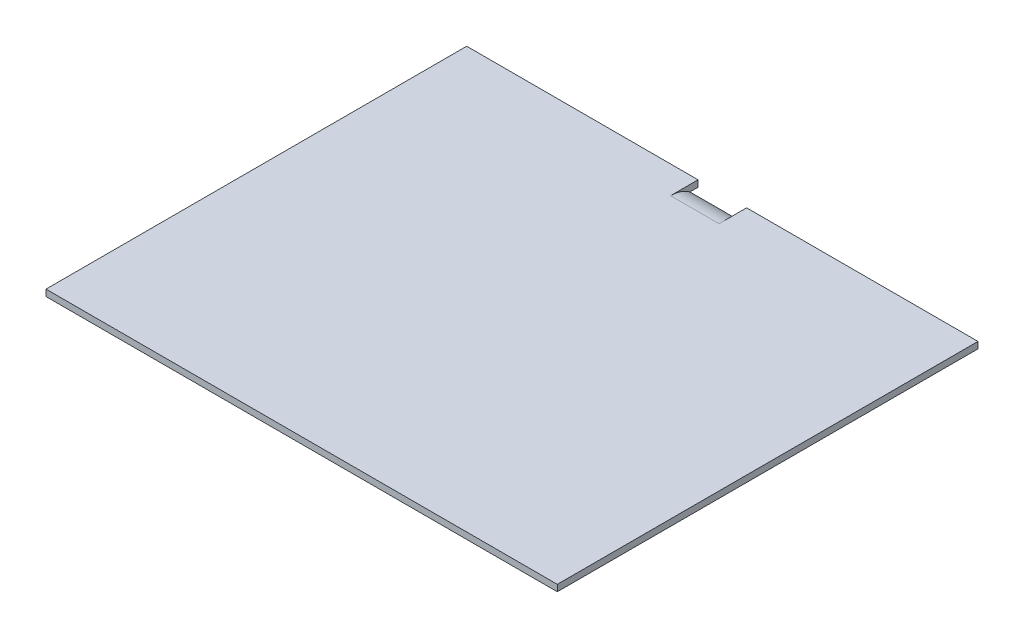
ISO-10303-21;
HEADER;
FILE_DESCRIPTION(('STEP AP214'),'2;1');
FILE_NAME('part.step','',(''),(''),'','','');
FILE_SCHEMA(('AUTOMOTIVE_DESIGN { 1 0 10303 214 1 1 1 1 }'));
ENDSEC;
DATA;
#1=APPLICATION_CONTEXT('core data for automotive mechanical design processes');
#2=APPLICATION_PROTOCOL_DEFINITION('international standard','automotive_design',2000,#1);
#3=PRODUCT_CONTEXT('',#1,'mechanical');
#4=PRODUCT('Part','Part','',(#3));
#5=PRODUCT_RELATED_PRODUCT_CATEGORY('part','',(#4));
#6=PRODUCT_DEFINITION_FORMATION('','',#4);
#7=PRODUCT_DEFINITION_CONTEXT('part definition',#1,'design');
#8=PRODUCT_DEFINITION('design','',#6,#7);
#9=PRODUCT_DEFINITION_SHAPE('','',#8);
#10=(LENGTH_UNIT() NAMED_UNIT(*) SI_UNIT(.MILLI.,.METRE.));
#11=(NAMED_UNIT(*) PLANE_ANGLE_UNIT() SI_UNIT($,.RADIAN.));
#12=(NAMED_UNIT(*) SI_UNIT($,.STERADIAN.) SOLID_ANGLE_UNIT());
#13=UNCERTAINTY_MEASURE_WITH_UNIT(LENGTH_MEASURE(1.E-05),#10,'distance_accuracy_value','');
#14=(GEOMETRIC_REPRESENTATION_CONTEXT(3) GLOBAL_UNCERTAINTY_ASSIGNED_CONTEXT((#13)) GLOBAL_UNIT_ASSIGNED_CONTEXT((#10,
#11,#12)) REPRESENTATION_CONTEXT('',''));
#15=CARTESIAN_POINT('',(0.,0.,0.));
#16=DIRECTION('',(0.,0.,1.));
#17=DIRECTION('',(1.,0.,0.));
#18=AXIS2_PLACEMENT_3D('',#15,#16,#17);
#19=CARTESIAN_POINT('',(-39.5,1.,-32.5));
#20=DIRECTION('',(0.,0.,1.));
#21=DIRECTION('',(1.,0.,0.));
#22=AXIS2_PLACEMENT_3D('',#19,#20,#21);
#23=PLANE('',#22);
#24=DIRECTION('',(-1.,0.,0.));
#25=VECTOR('',#24,1.);
#26=CARTESIAN_POINT('',(-39.5,1.,-32.5));
#27=LINE('',#26,#25);
#28=CARTESIAN_POINT('',(-3.74999999999999,1.,-32.5));
#29=VERTEX_POINT('',#28);
#30=CARTESIAN_POINT('',(-39.5,1.,-32.5));
#31=VERTEX_POINT('',#30);
#32=EDGE_CURVE('E118',#29,#31,#27,.T.);
#33=ORIENTED_EDGE('',*,*,#32,.F.);
#34=DIRECTION('',(0.,1.,0.));
#35=VECTOR('',#34,1.);
#36=CARTESIAN_POINT('',(-3.74999999999998,4.25,-32.5));
#37=LINE('',#36,#35);
#38=CARTESIAN_POINT('',(-3.74999999999999,0.,-32.5));
#39=VERTEX_POINT('',#38);
#40=EDGE_CURVE('E105',#39,#29,#37,.T.);
#41=ORIENTED_EDGE('',*,*,#40,.F.);
#42=DIRECTION('',(-1.,0.,0.));
#43=VECTOR('',#42,1.);
#44=CARTESIAN_POINT('',(-39.5,0.,-32.5));
#45=LINE('',#44,#43);
#46=CARTESIAN_POINT('',(-39.5,0.,-32.5));
#47=VERTEX_POINT('',#46);
#48=EDGE_CURVE('E116',#39,#47,#45,.T.);
#49=ORIENTED_EDGE('',*,*,#48,.T.);
#50=DIRECTION('',(0.,-1.,0.));
#51=VECTOR('',#50,1.);
#52=CARTESIAN_POINT('',(-39.5,1.,-32.5));
#53=LINE('',#52,#51);
#54=EDGE_CURVE('E144',#31,#47,#53,.T.);
#55=ORIENTED_EDGE('',*,*,#54,.F.);
#56=EDGE_LOOP('',(#33,#41,#49,#55));
#57=FACE_BOUND('',#56,.T.);
#58=ADVANCED_FACE('F39',(#57),#23,.F.);
#59=CARTESIAN_POINT('',(39.5,1.,-32.5));
#60=DIRECTION('',(-1.,0.,0.));
#61=DIRECTION('',(0.,0.,1.));
#62=AXIS2_PLACEMENT_3D('',#59,#60,#61);
#63=PLANE('',#62);
#64=DIRECTION('',(0.,0.,-1.));
#65=VECTOR('',#64,1.);
#66=CARTESIAN_POINT('',(39.5,0.,-32.5));
#67=LINE('',#66,#65);
#68=CARTESIAN_POINT('',(39.5,0.,32.5));
#69=VERTEX_POINT('',#68);
#70=CARTESIAN_POINT('',(39.5,0.,-32.5));
#71=VERTEX_POINT('',#70);
#72=EDGE_CURVE('E126',#69,#71,#67,.T.);
#73=ORIENTED_EDGE('',*,*,#72,.T.);
#74=DIRECTION('',(0.,-1.,0.));
#75=VECTOR('',#74,1.);
#76=CARTESIAN_POINT('',(39.5,1.,-32.5));
#77=LINE('',#76,#75);
#78=CARTESIAN_POINT('',(39.5,1.,-32.5));
#79=VERTEX_POINT('',#78);
#80=EDGE_CURVE('E146',#79,#71,#77,.T.);
#81=ORIENTED_EDGE('',*,*,#80,.F.);
#82=DIRECTION('',(0.,0.,-1.));
#83=VECTOR('',#82,1.);
#84=CARTESIAN_POINT('',(39.5,1.,-32.5));
#85=LINE('',#84,#83);
#86=CARTESIAN_POINT('',(39.5,1.,32.5));
#87=VERTEX_POINT('',#86);
#88=EDGE_CURVE('E136',#87,#79,#85,.T.);
#89=ORIENTED_EDGE('',*,*,#88,.F.);
#90=DIRECTION('',(0.,-1.,0.));
#91=VECTOR('',#90,1.);
#92=CARTESIAN_POINT('',(39.5,1.,32.5));
#93=LINE('',#92,#91);
#94=EDGE_CURVE('E137',#87,#69,#93,.T.);
#95=ORIENTED_EDGE('',*,*,#94,.T.);
#96=EDGE_LOOP('',(#73,#81,#89,#95));
#97=FACE_BOUND('',#96,.T.);
#98=ADVANCED_FACE('F167',(#97),#63,.F.);
#99=CARTESIAN_POINT('',(3.75000000000001,0.,-32.5));
#100=VERTEX_POINT('',#99);
#101=EDGE_CURVE('E125',#71,#100,#45,.T.);
#102=ORIENTED_EDGE('',*,*,#101,.T.);
#103=DIRECTION('',(0.,-1.,0.));
#104=VECTOR('',#103,1.);
#105=CARTESIAN_POINT('',(3.75000000000001,4.25,-32.5));
#106=LINE('',#105,#104);
#107=CARTESIAN_POINT('',(3.75000000000001,1.,-32.5));
#108=VERTEX_POINT('',#107);
#109=EDGE_CURVE('E119',#108,#100,#106,.T.);
#110=ORIENTED_EDGE('',*,*,#109,.F.);
#111=EDGE_CURVE('E163',#79,#108,#27,.T.);
#112=ORIENTED_EDGE('',*,*,#111,.F.);
#113=ORIENTED_EDGE('',*,*,#80,.T.);
#114=EDGE_LOOP('',(#102,#110,#112,#113));
#115=FACE_BOUND('',#114,.T.);
#116=ADVANCED_FACE('F161',(#115),#23,.F.);
#117=CARTESIAN_POINT('',(-39.5,1.,-32.5));
#118=DIRECTION('',(1.,0.,0.));
#119=DIRECTION('',(0.,0.,-1.));
#120=AXIS2_PLACEMENT_3D('',#117,#118,#119);
#121=PLANE('',#120);
#122=DIRECTION('',(0.,0.,1.));
#123=VECTOR('',#122,1.);
#124=CARTESIAN_POINT('',(-39.5,0.,-32.5));
#125=LINE('',#124,#123);
#126=CARTESIAN_POINT('',(-39.5,0.,32.5));
#127=VERTEX_POINT('',#126);
#128=EDGE_CURVE('E124',#47,#127,#125,.T.);
#129=ORIENTED_EDGE('',*,*,#128,.T.);
#130=DIRECTION('',(0.,-1.,0.));
#131=VECTOR('',#130,1.);
#132=CARTESIAN_POINT('',(-39.5,1.,32.5));
#133=LINE('',#132,#131);
#134=CARTESIAN_POINT('',(-39.5,1.,32.5));
#135=VERTEX_POINT('',#134);
#136=EDGE_CURVE('E140',#135,#127,#133,.T.);
#137=ORIENTED_EDGE('',*,*,#136,.F.);
#138=DIRECTION('',(0.,0.,1.));
#139=VECTOR('',#138,1.);
#140=CARTESIAN_POINT('',(-39.5,1.,-32.5));
#141=LINE('',#140,#139);
#142=EDGE_CURVE('E176',#31,#135,#141,.T.);
#143=ORIENTED_EDGE('',*,*,#142,.F.);
#144=ORIENTED_EDGE('',*,*,#54,.T.);
#145=EDGE_LOOP('',(#129,#137,#143,#144));
#146=FACE_BOUND('',#145,.T.);
#147=ADVANCED_FACE('F175',(#146),#121,.F.);
#148=CARTESIAN_POINT('',(-39.5,1.,32.5));
#149=DIRECTION('',(0.,0.,-1.));
#150=DIRECTION('',(-1.,0.,0.));
#151=AXIS2_PLACEMENT_3D('',#148,#149,#150);
#152=PLANE('',#151);
#153=DIRECTION('',(1.,0.,0.));
#154=VECTOR('',#153,1.);
#155=CARTESIAN_POINT('',(-39.5,0.,32.5));
#156=LINE('',#155,#154);
#157=EDGE_CURVE('E134',#127,#69,#156,.T.);
#158=ORIENTED_EDGE('',*,*,#157,.T.);
#159=ORIENTED_EDGE('',*,*,#94,.F.);
#160=DIRECTION('',(1.,0.,0.));
#161=VECTOR('',#160,1.);
#162=CARTESIAN_POINT('',(-39.5,1.,32.5));
#163=LINE('',#162,#161);
#164=EDGE_CURVE('E141',#135,#87,#163,.T.);
#165=ORIENTED_EDGE('',*,*,#164,.F.);
#166=ORIENTED_EDGE('',*,*,#136,.T.);
#167=EDGE_LOOP('',(#158,#159,#165,#166));
#168=FACE_BOUND('',#167,.T.);
#169=ADVANCED_FACE('F170',(#168),#152,.F.);
#170=CARTESIAN_POINT('',(0.,1.,0.));
#171=DIRECTION('',(0.,1.,0.));
#172=DIRECTION('',(0.,0.,1.));
#173=AXIS2_PLACEMENT_3D('',#170,#171,#172);
#174=PLANE('',#173);
#175=DIRECTION('',(-1.,0.,0.));
#176=VECTOR('',#175,1.);
#177=CARTESIAN_POINT('',(-3.74999999999999,1.,-28.25));
#178=LINE('',#177,#176);
#179=CARTESIAN_POINT('',(3.75000000000001,1.,-28.25));
#180=VERTEX_POINT('',#179);
#181=CARTESIAN_POINT('',(-3.74999999999999,1.,-28.25));
#182=VERTEX_POINT('',#181);
#183=EDGE_CURVE('E110',#180,#182,#178,.T.);
#184=ORIENTED_EDGE('',*,*,#183,.T.);
#185=DIRECTION('',(0.,0.,1.));
#186=VECTOR('',#185,1.);
#187=CARTESIAN_POINT('',(-3.74999999999999,1.,0.));
#188=LINE('',#187,#186);
#189=EDGE_CURVE('E54',#29,#182,#188,.T.);
#190=ORIENTED_EDGE('',*,*,#189,.F.);
#191=ORIENTED_EDGE('',*,*,#32,.T.);
#192=ORIENTED_EDGE('',*,*,#142,.T.);
#193=ORIENTED_EDGE('',*,*,#164,.T.);
#194=ORIENTED_EDGE('',*,*,#88,.T.);
#195=ORIENTED_EDGE('',*,*,#111,.T.);
#196=DIRECTION('',(0.,0.,-1.));
#197=VECTOR('',#196,1.);
#198=CARTESIAN_POINT('',(3.75000000000001,1.,0.));
#199=LINE('',#198,#197);
#200=EDGE_CURVE('E62',#180,#108,#199,.T.);
#201=ORIENTED_EDGE('',*,*,#200,.F.);
#202=EDGE_LOOP('',(#184,#190,#191,#192,#193,#194,#195,#201));
#203=FACE_BOUND('',#202,.T.);
#204=ADVANCED_FACE('F154',(#203),#174,.T.);
#205=CARTESIAN_POINT('',(0.,0.,0.));
#206=DIRECTION('',(0.,1.,0.));
#207=DIRECTION('',(0.,0.,1.));
#208=AXIS2_PLACEMENT_3D('',#205,#206,#207);
#209=PLANE('',#208);
#210=ORIENTED_EDGE('',*,*,#48,.F.);
#211=DIRECTION('',(0.,0.,1.));
#212=VECTOR('',#211,1.);
#213=CARTESIAN_POINT('',(-3.74999999999999,0.,0.));
#214=LINE('',#213,#212);
#215=CARTESIAN_POINT('',(-3.74999999999999,0.,-31.25));
#216=VERTEX_POINT('',#215);
#217=EDGE_CURVE('E102',#39,#216,#214,.T.);
#218=ORIENTED_EDGE('',*,*,#217,.T.);
#219=DIRECTION('',(-1.,0.,0.));
#220=VECTOR('',#219,1.);
#221=CARTESIAN_POINT('',(0.,0.,-31.25));
#222=LINE('',#221,#220);
#223=CARTESIAN_POINT('',(3.75000000000001,0.,-31.25));
#224=VERTEX_POINT('',#223);
#225=EDGE_CURVE('E149',#224,#216,#222,.T.);
#226=ORIENTED_EDGE('',*,*,#225,.F.);
#227=DIRECTION('',(0.,0.,-1.));
#228=VECTOR('',#227,1.);
#229=CARTESIAN_POINT('',(3.75000000000001,0.,0.));
#230=LINE('',#229,#228);
#231=EDGE_CURVE('E111',#224,#100,#230,.T.);
#232=ORIENTED_EDGE('',*,*,#231,.T.);
#233=ORIENTED_EDGE('',*,*,#101,.F.);
#234=ORIENTED_EDGE('',*,*,#72,.F.);
#235=ORIENTED_EDGE('',*,*,#157,.F.);
#236=ORIENTED_EDGE('',*,*,#128,.F.);
#237=EDGE_LOOP('',(#210,#218,#226,#232,#233,#234,#235,#236));
#238=FACE_BOUND('',#237,.T.);
#239=ADVANCED_FACE('F122',(#238),#209,.F.);
#240=CARTESIAN_POINT('',(-3.74999999999998,4.25,-31.25));
#241=DIRECTION('',(-1.,0.,0.));
#242=DIRECTION('',(0.,-1.,0.));
#243=AXIS2_PLACEMENT_3D('',#240,#241,#242);
#244=PLANE('',#243);
#245=ORIENTED_EDGE('',*,*,#189,.T.);
#246=CARTESIAN_POINT('',(-3.74999999999999,-4.,-28.25));
#247=DIRECTION('',(-1.,0.,0.));
#248=DIRECTION('',(0.,-1.,0.));
#249=AXIS2_PLACEMENT_3D('',#246,#247,#248);
#250=CIRCLE('',#249,5.);
#251=EDGE_CURVE('E47',#182,#216,#250,.T.);
#252=ORIENTED_EDGE('',*,*,#251,.T.);
#253=ORIENTED_EDGE('',*,*,#217,.F.);
#254=ORIENTED_EDGE('',*,*,#40,.T.);
#255=EDGE_LOOP('',(#245,#252,#253,#254));
#256=FACE_BOUND('',#255,.T.);
#257=ADVANCED_FACE('F104',(#256),#244,.F.);
#258=CARTESIAN_POINT('',(3.75000000000001,4.25,-31.25));
#259=DIRECTION('',(1.,0.,0.));
#260=DIRECTION('',(0.,1.,0.));
#261=AXIS2_PLACEMENT_3D('',#258,#259,#260);
#262=PLANE('',#261);
#263=ORIENTED_EDGE('',*,*,#200,.T.);
#264=ORIENTED_EDGE('',*,*,#109,.T.);
#265=ORIENTED_EDGE('',*,*,#231,.F.);
#266=CARTESIAN_POINT('',(3.75000000000001,-4.,-28.25));
#267=DIRECTION('',(1.,0.,0.));
#268=DIRECTION('',(0.,1.,0.));
#269=AXIS2_PLACEMENT_3D('',#266,#267,#268);
#270=CIRCLE('',#269,5.);
#271=EDGE_CURVE('E11',#224,#180,#270,.T.);
#272=ORIENTED_EDGE('',*,*,#271,.T.);
#273=EDGE_LOOP('',(#263,#264,#265,#272));
#274=FACE_BOUND('',#273,.T.);
#275=ADVANCED_FACE('F183',(#274),#262,.F.);
#276=CARTESIAN_POINT('',(0.,-4.,-28.25));
#277=DIRECTION('',(1.,0.,0.));
#278=DIRECTION('',(0.,0.,-1.));
#279=AXIS2_PLACEMENT_3D('',#276,#277,#278);
#280=CYLINDRICAL_SURFACE('',#279,5.);
#281=ORIENTED_EDGE('',*,*,#271,.F.);
#282=ORIENTED_EDGE('',*,*,#225,.T.);
#283=ORIENTED_EDGE('',*,*,#251,.F.);
#284=ORIENTED_EDGE('',*,*,#183,.F.);
#285=EDGE_LOOP('',(#281,#282,#283,#284));
#286=FACE_BOUND('',#285,.T.);
#287=ADVANCED_FACE('F41',(#286),#280,.T.);
#288=CLOSED_SHELL('',(#58,#98,#116,#147,#169,#204,#239,#257,#275,#287));
#289=MANIFOLD_SOLID_BREP('B2',#288);
#290=ADVANCED_BREP_SHAPE_REPRESENTATION('',(#18,#289),#14);
#291=SHAPE_DEFINITION_REPRESENTATION(#9,#290);
ENDSEC;
END-ISO-10303-21;
